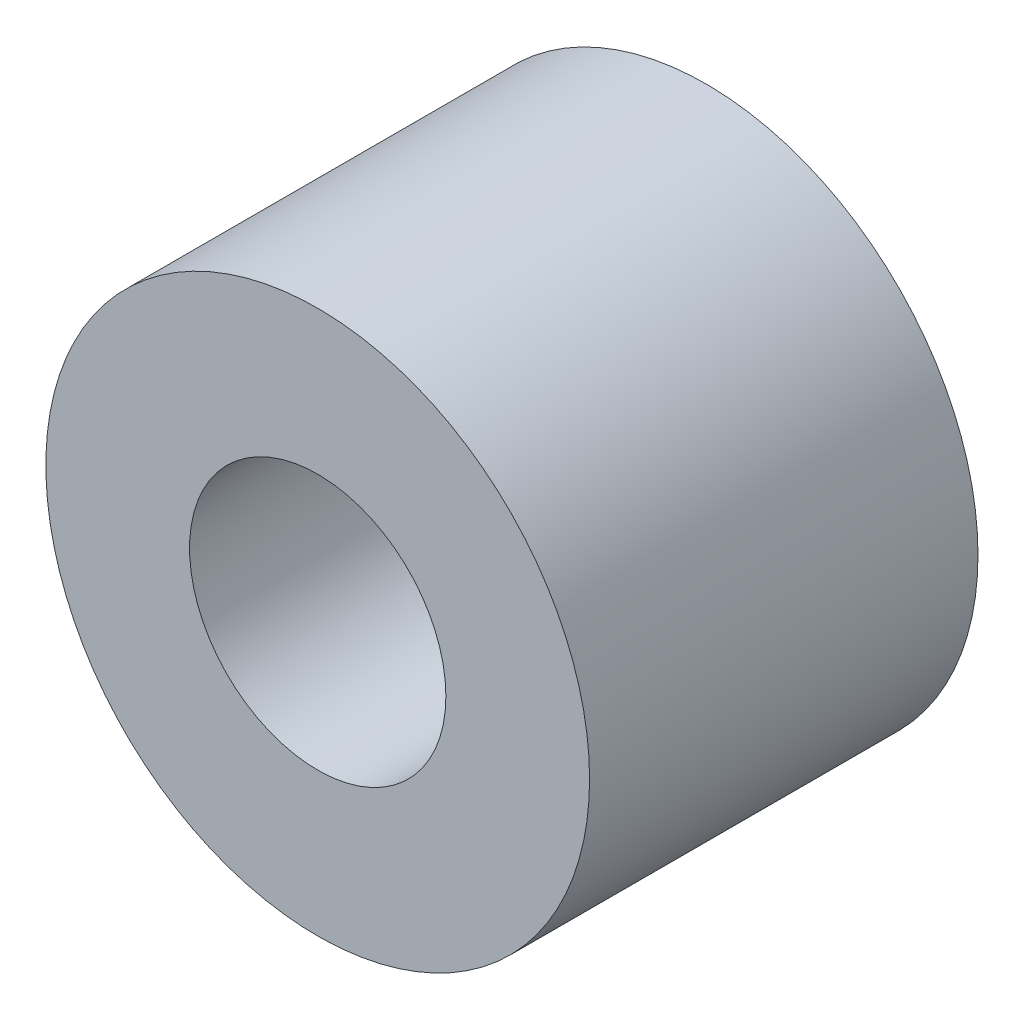
ISO-10303-21;
HEADER;
FILE_DESCRIPTION(('STEP AP214'),'2;1');
FILE_NAME('part.step','',(''),(''),'','','');
FILE_SCHEMA(('AUTOMOTIVE_DESIGN { 1 0 10303 214 1 1 1 1 }'));
ENDSEC;
DATA;
#1=APPLICATION_CONTEXT('core data for automotive mechanical design processes');
#2=APPLICATION_PROTOCOL_DEFINITION('international standard','automotive_design',2000,#1);
#3=PRODUCT_CONTEXT('',#1,'mechanical');
#4=PRODUCT('Part','Part','',(#3));
#5=PRODUCT_RELATED_PRODUCT_CATEGORY('part','',(#4));
#6=PRODUCT_DEFINITION_FORMATION('','',#4);
#7=PRODUCT_DEFINITION_CONTEXT('part definition',#1,'design');
#8=PRODUCT_DEFINITION('design','',#6,#7);
#9=PRODUCT_DEFINITION_SHAPE('','',#8);
#10=(LENGTH_UNIT() NAMED_UNIT(*) SI_UNIT(.MILLI.,.METRE.));
#11=(NAMED_UNIT(*) PLANE_ANGLE_UNIT() SI_UNIT($,.RADIAN.));
#12=(NAMED_UNIT(*) SI_UNIT($,.STERADIAN.) SOLID_ANGLE_UNIT());
#13=UNCERTAINTY_MEASURE_WITH_UNIT(LENGTH_MEASURE(1.E-05),#10,'distance_accuracy_value','');
#14=(GEOMETRIC_REPRESENTATION_CONTEXT(3) GLOBAL_UNCERTAINTY_ASSIGNED_CONTEXT((#13)) GLOBAL_UNIT_ASSIGNED_CONTEXT((#10,
#11,#12)) REPRESENTATION_CONTEXT('',''));
#15=CARTESIAN_POINT('',(0.,0.,0.));
#16=DIRECTION('',(0.,0.,1.));
#17=DIRECTION('',(1.,0.,0.));
#18=AXIS2_PLACEMENT_3D('',#15,#16,#17);
#19=CARTESIAN_POINT('',(0.,0.,5.));
#20=DIRECTION('',(0.,0.,1.));
#21=DIRECTION('',(1.,0.,0.));
#22=AXIS2_PLACEMENT_3D('',#19,#20,#21);
#23=PLANE('',#22);
#24=CARTESIAN_POINT('',(0.,0.,5.));
#25=DIRECTION('',(0.,0.,1.));
#26=DIRECTION('',(1.,0.,0.));
#27=AXIS2_PLACEMENT_3D('',#24,#25,#26);
#28=CIRCLE('',#27,3.5);
#29=CARTESIAN_POINT('',(3.5,0.,5.));
#30=VERTEX_POINT('',#29);
#31=EDGE_CURVE('E10',#30,#30,#28,.T.);
#32=ORIENTED_EDGE('',*,*,#31,.T.);
#33=EDGE_LOOP('',(#32));
#34=FACE_BOUND('',#33,.T.);
#35=CARTESIAN_POINT('',(0.,0.,5.));
#36=DIRECTION('',(0.,0.,1.));
#37=DIRECTION('',(1.,0.,0.));
#38=AXIS2_PLACEMENT_3D('',#35,#36,#37);
#39=CIRCLE('',#38,1.65);
#40=CARTESIAN_POINT('',(1.65,0.,5.));
#41=VERTEX_POINT('',#40);
#42=EDGE_CURVE('E44',#41,#41,#39,.T.);
#43=ORIENTED_EDGE('',*,*,#42,.F.);
#44=EDGE_LOOP('',(#43));
#45=FACE_BOUND('',#44,.T.);
#46=ADVANCED_FACE('F33',(#34,#45),#23,.T.);
#47=CARTESIAN_POINT('',(0.,0.,0.));
#48=DIRECTION('',(0.,0.,1.));
#49=DIRECTION('',(1.,0.,0.));
#50=AXIS2_PLACEMENT_3D('',#47,#48,#49);
#51=PLANE('',#50);
#52=CARTESIAN_POINT('',(0.,0.,0.));
#53=DIRECTION('',(0.,0.,1.));
#54=DIRECTION('',(1.,0.,0.));
#55=AXIS2_PLACEMENT_3D('',#52,#53,#54);
#56=CIRCLE('',#55,3.5);
#57=CARTESIAN_POINT('',(3.5,0.,0.));
#58=VERTEX_POINT('',#57);
#59=EDGE_CURVE('E37',#58,#58,#56,.T.);
#60=ORIENTED_EDGE('',*,*,#59,.F.);
#61=EDGE_LOOP('',(#60));
#62=FACE_BOUND('',#61,.T.);
#63=CARTESIAN_POINT('',(0.,0.,0.));
#64=DIRECTION('',(0.,0.,1.));
#65=DIRECTION('',(1.,0.,0.));
#66=AXIS2_PLACEMENT_3D('',#63,#64,#65);
#67=CIRCLE('',#66,1.65);
#68=CARTESIAN_POINT('',(1.65,0.,0.));
#69=VERTEX_POINT('',#68);
#70=EDGE_CURVE('E46',#69,#69,#67,.T.);
#71=ORIENTED_EDGE('',*,*,#70,.T.);
#72=EDGE_LOOP('',(#71));
#73=FACE_BOUND('',#72,.T.);
#74=ADVANCED_FACE('F56',(#62,#73),#51,.F.);
#75=CARTESIAN_POINT('',(0.,0.,5.));
#76=DIRECTION('',(0.,0.,-1.));
#77=DIRECTION('',(-1.,0.,0.));
#78=AXIS2_PLACEMENT_3D('',#75,#76,#77);
#79=CYLINDRICAL_SURFACE('',#78,3.5);
#80=ORIENTED_EDGE('',*,*,#31,.F.);
#81=EDGE_LOOP('',(#80));
#82=FACE_BOUND('',#81,.T.);
#83=ORIENTED_EDGE('',*,*,#59,.T.);
#84=EDGE_LOOP('',(#83));
#85=FACE_BOUND('',#84,.T.);
#86=ADVANCED_FACE('F35',(#82,#85),#79,.T.);
#87=CARTESIAN_POINT('',(0.,0.,5.));
#88=DIRECTION('',(0.,0.,-1.));
#89=DIRECTION('',(-1.,0.,0.));
#90=AXIS2_PLACEMENT_3D('',#87,#88,#89);
#91=CYLINDRICAL_SURFACE('',#90,1.65);
#92=ORIENTED_EDGE('',*,*,#42,.T.);
#93=EDGE_LOOP('',(#92));
#94=FACE_BOUND('',#93,.T.);
#95=ORIENTED_EDGE('',*,*,#70,.F.);
#96=EDGE_LOOP('',(#95));
#97=FACE_BOUND('',#96,.T.);
#98=ADVANCED_FACE('F52',(#94,#97),#91,.F.);
#99=CLOSED_SHELL('',(#46,#74,#86,#98));
#100=MANIFOLD_SOLID_BREP('B2',#99);
#101=ADVANCED_BREP_SHAPE_REPRESENTATION('',(#18,#100),#14);
#102=SHAPE_DEFINITION_REPRESENTATION(#9,#101);
ENDSEC;
END-ISO-10303-21;
